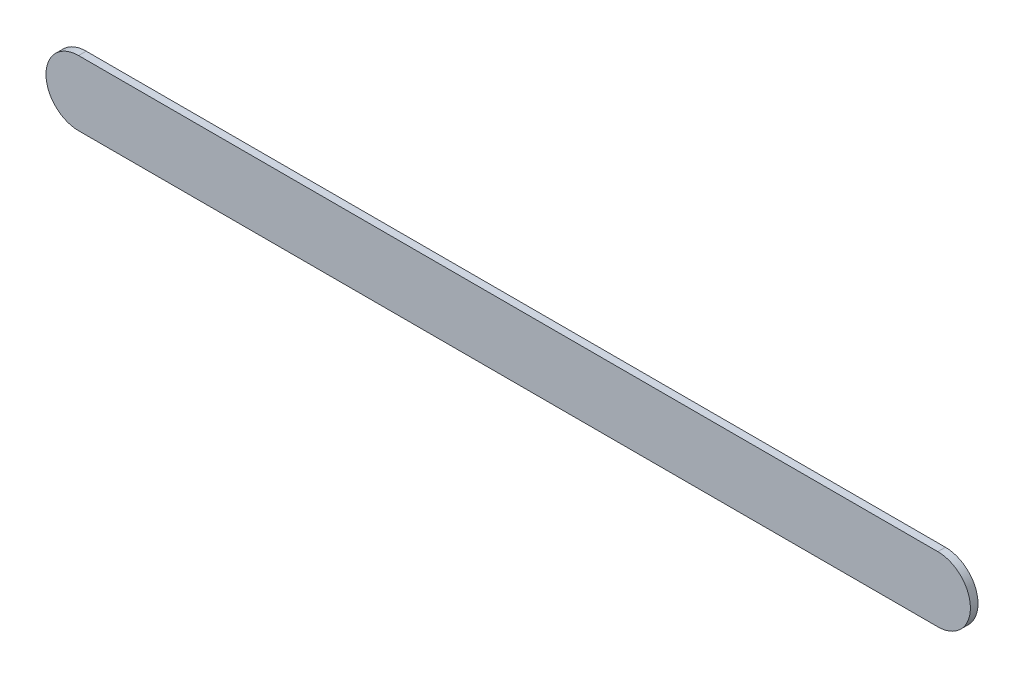
ISO-10303-21;
HEADER;
FILE_DESCRIPTION(('STEP AP214'),'2;1');
FILE_NAME('part.step','',(''),(''),'','','');
FILE_SCHEMA(('AUTOMOTIVE_DESIGN { 1 0 10303 214 1 1 1 1 }'));
ENDSEC;
DATA;
#1=APPLICATION_CONTEXT('core data for automotive mechanical design processes');
#2=APPLICATION_PROTOCOL_DEFINITION('international standard','automotive_design',2000,#1);
#3=PRODUCT_CONTEXT('',#1,'mechanical');
#4=PRODUCT('Part','Part','',(#3));
#5=PRODUCT_RELATED_PRODUCT_CATEGORY('part','',(#4));
#6=PRODUCT_DEFINITION_FORMATION('','',#4);
#7=PRODUCT_DEFINITION_CONTEXT('part definition',#1,'design');
#8=PRODUCT_DEFINITION('design','',#6,#7);
#9=PRODUCT_DEFINITION_SHAPE('','',#8);
#10=(LENGTH_UNIT() NAMED_UNIT(*) SI_UNIT(.MILLI.,.METRE.));
#11=(NAMED_UNIT(*) PLANE_ANGLE_UNIT() SI_UNIT($,.RADIAN.));
#12=(NAMED_UNIT(*) SI_UNIT($,.STERADIAN.) SOLID_ANGLE_UNIT());
#13=UNCERTAINTY_MEASURE_WITH_UNIT(LENGTH_MEASURE(1.E-05),#10,'distance_accuracy_value','');
#14=(GEOMETRIC_REPRESENTATION_CONTEXT(3) GLOBAL_UNCERTAINTY_ASSIGNED_CONTEXT((#13)) GLOBAL_UNIT_ASSIGNED_CONTEXT((#10,
#11,#12)) REPRESENTATION_CONTEXT('',''));
#15=CARTESIAN_POINT('',(0.,0.,0.));
#16=DIRECTION('',(0.,0.,1.));
#17=DIRECTION('',(1.,0.,0.));
#18=AXIS2_PLACEMENT_3D('',#15,#16,#17);
#19=CARTESIAN_POINT('',(131.4125,-67.149999,1.635));
#20=DIRECTION('',(0.,0.,1.));
#21=DIRECTION('',(1.,0.,0.));
#22=AXIS2_PLACEMENT_3D('',#19,#20,#21);
#23=PLANE('',#22);
#24=DIRECTION('',(1.,0.,0.));
#25=VECTOR('',#24,1.);
#26=CARTESIAN_POINT('',(131.4125,-67.149999,1.635));
#27=LINE('',#26,#25);
#28=CARTESIAN_POINT('',(131.4125,-67.149999,1.635));
#29=VERTEX_POINT('',#28);
#30=CARTESIAN_POINT('',(135.370001,-67.149999,1.635));
#31=VERTEX_POINT('',#30);
#32=EDGE_CURVE('E92',#29,#31,#27,.T.);
#33=ORIENTED_EDGE('',*,*,#32,.T.);
#34=CARTESIAN_POINT('',(135.370001,-66.999999,1.635));
#35=DIRECTION('',(0.,0.,1.));
#36=DIRECTION('',(0.,-1.,0.));
#37=AXIS2_PLACEMENT_3D('',#34,#35,#36);
#38=CIRCLE('',#37,0.15);
#39=CARTESIAN_POINT('',(135.370001,-66.849999,1.635));
#40=VERTEX_POINT('',#39);
#41=EDGE_CURVE('E87',#31,#40,#38,.T.);
#42=ORIENTED_EDGE('',*,*,#41,.T.);
#43=DIRECTION('',(-1.,0.,0.));
#44=VECTOR('',#43,1.);
#45=CARTESIAN_POINT('',(135.370001,-66.849999,1.635));
#46=LINE('',#45,#44);
#47=CARTESIAN_POINT('',(131.4125,-66.849999,1.635));
#48=VERTEX_POINT('',#47);
#49=EDGE_CURVE('E102',#40,#48,#46,.T.);
#50=ORIENTED_EDGE('',*,*,#49,.T.);
#51=CARTESIAN_POINT('',(131.4125,-66.999999,1.635));
#52=DIRECTION('',(0.,0.,1.));
#53=DIRECTION('',(1.894780628694E-13,1.,0.));
#54=AXIS2_PLACEMENT_3D('',#51,#52,#53);
#55=CIRCLE('',#54,0.15);
#56=EDGE_CURVE('E11',#48,#29,#55,.T.);
#57=ORIENTED_EDGE('',*,*,#56,.T.);
#58=EDGE_LOOP('',(#33,#42,#50,#57));
#59=FACE_BOUND('',#58,.T.);
#60=ADVANCED_FACE('F17',(#59),#23,.T.);
#61=CARTESIAN_POINT('',(131.4125,-67.149999,1.6));
#62=DIRECTION('',(0.,0.,1.));
#63=DIRECTION('',(1.,0.,0.));
#64=AXIS2_PLACEMENT_3D('',#61,#62,#63);
#65=PLANE('',#64);
#66=CARTESIAN_POINT('',(131.4125,-66.999999,1.6));
#67=DIRECTION('',(0.,0.,1.));
#68=DIRECTION('',(1.894780628694E-13,1.,0.));
#69=AXIS2_PLACEMENT_3D('',#66,#67,#68);
#70=CIRCLE('',#69,0.15);
#71=CARTESIAN_POINT('',(131.4125,-66.849999,1.6));
#72=VERTEX_POINT('',#71);
#73=CARTESIAN_POINT('',(131.4125,-67.149999,1.6));
#74=VERTEX_POINT('',#73);
#75=EDGE_CURVE('E26',#72,#74,#70,.T.);
#76=ORIENTED_EDGE('',*,*,#75,.F.);
#77=DIRECTION('',(-1.,0.,0.));
#78=VECTOR('',#77,1.);
#79=CARTESIAN_POINT('',(135.370001,-66.849999,1.6));
#80=LINE('',#79,#78);
#81=CARTESIAN_POINT('',(135.370001,-66.849999,1.6));
#82=VERTEX_POINT('',#81);
#83=EDGE_CURVE('E75',#82,#72,#80,.T.);
#84=ORIENTED_EDGE('',*,*,#83,.F.);
#85=CARTESIAN_POINT('',(135.370001,-66.999999,1.6));
#86=DIRECTION('',(0.,0.,1.));
#87=DIRECTION('',(0.,-1.,0.));
#88=AXIS2_PLACEMENT_3D('',#85,#86,#87);
#89=CIRCLE('',#88,0.15);
#90=CARTESIAN_POINT('',(135.370001,-67.149999,1.6));
#91=VERTEX_POINT('',#90);
#92=EDGE_CURVE('E69',#91,#82,#89,.T.);
#93=ORIENTED_EDGE('',*,*,#92,.F.);
#94=DIRECTION('',(1.,0.,0.));
#95=VECTOR('',#94,1.);
#96=CARTESIAN_POINT('',(131.4125,-67.149999,1.6));
#97=LINE('',#96,#95);
#98=EDGE_CURVE('E73',#74,#91,#97,.T.);
#99=ORIENTED_EDGE('',*,*,#98,.F.);
#100=EDGE_LOOP('',(#76,#84,#93,#99));
#101=FACE_BOUND('',#100,.T.);
#102=ADVANCED_FACE('F71',(#101),#65,.F.);
#103=CARTESIAN_POINT('',(131.4125,-66.999999,1.6));
#104=DIRECTION('',(0.,0.,-1.));
#105=DIRECTION('',(1.894780628694E-13,1.,0.));
#106=AXIS2_PLACEMENT_3D('',#103,#104,#105);
#107=CYLINDRICAL_SURFACE('',#106,0.15);
#108=ORIENTED_EDGE('',*,*,#75,.T.);
#109=DIRECTION('',(0.,0.,1.));
#110=VECTOR('',#109,1.);
#111=CARTESIAN_POINT('',(131.4125,-67.149999,1.6));
#112=LINE('',#111,#110);
#113=EDGE_CURVE('E81',#74,#29,#112,.T.);
#114=ORIENTED_EDGE('',*,*,#113,.T.);
#115=ORIENTED_EDGE('',*,*,#56,.F.);
#116=DIRECTION('',(0.,0.,1.));
#117=VECTOR('',#116,1.);
#118=CARTESIAN_POINT('',(131.4125,-66.849999,1.6));
#119=LINE('',#118,#117);
#120=EDGE_CURVE('E20',#72,#48,#119,.T.);
#121=ORIENTED_EDGE('',*,*,#120,.F.);
#122=EDGE_LOOP('',(#108,#114,#115,#121));
#123=FACE_BOUND('',#122,.T.);
#124=ADVANCED_FACE('F123',(#123),#107,.T.);
#125=CARTESIAN_POINT('',(135.370001,-66.849999,1.6));
#126=DIRECTION('',(0.,-1.,0.));
#127=DIRECTION('',(0.,0.,-1.));
#128=AXIS2_PLACEMENT_3D('',#125,#126,#127);
#129=PLANE('',#128);
#130=ORIENTED_EDGE('',*,*,#83,.T.);
#131=ORIENTED_EDGE('',*,*,#120,.T.);
#132=ORIENTED_EDGE('',*,*,#49,.F.);
#133=DIRECTION('',(0.,0.,1.));
#134=VECTOR('',#133,1.);
#135=CARTESIAN_POINT('',(135.370001,-66.849999,1.6));
#136=LINE('',#135,#134);
#137=EDGE_CURVE('E80',#82,#40,#136,.T.);
#138=ORIENTED_EDGE('',*,*,#137,.F.);
#139=EDGE_LOOP('',(#130,#131,#132,#138));
#140=FACE_BOUND('',#139,.T.);
#141=ADVANCED_FACE('F122',(#140),#129,.F.);
#142=CARTESIAN_POINT('',(135.370001,-66.999999,1.6));
#143=DIRECTION('',(0.,0.,-1.));
#144=DIRECTION('',(0.,-1.,0.));
#145=AXIS2_PLACEMENT_3D('',#142,#143,#144);
#146=CYLINDRICAL_SURFACE('',#145,0.15);
#147=ORIENTED_EDGE('',*,*,#92,.T.);
#148=ORIENTED_EDGE('',*,*,#137,.T.);
#149=ORIENTED_EDGE('',*,*,#41,.F.);
#150=DIRECTION('',(0.,0.,1.));
#151=VECTOR('',#150,1.);
#152=CARTESIAN_POINT('',(135.370001,-67.149999,1.6));
#153=LINE('',#152,#151);
#154=EDGE_CURVE('E84',#91,#31,#153,.T.);
#155=ORIENTED_EDGE('',*,*,#154,.F.);
#156=EDGE_LOOP('',(#147,#148,#149,#155));
#157=FACE_BOUND('',#156,.T.);
#158=ADVANCED_FACE('F85',(#157),#146,.T.);
#159=CARTESIAN_POINT('',(131.4125,-67.149999,1.6));
#160=DIRECTION('',(0.,1.,0.));
#161=DIRECTION('',(1.,0.,0.));
#162=AXIS2_PLACEMENT_3D('',#159,#160,#161);
#163=PLANE('',#162);
#164=ORIENTED_EDGE('',*,*,#98,.T.);
#165=ORIENTED_EDGE('',*,*,#154,.T.);
#166=ORIENTED_EDGE('',*,*,#32,.F.);
#167=ORIENTED_EDGE('',*,*,#113,.F.);
#168=EDGE_LOOP('',(#164,#165,#166,#167));
#169=FACE_BOUND('',#168,.T.);
#170=ADVANCED_FACE('F95',(#169),#163,.F.);
#171=CLOSED_SHELL('',(#60,#102,#124,#141,#158,#170));
#172=MANIFOLD_SOLID_BREP('B1',#171);
#173=ADVANCED_BREP_SHAPE_REPRESENTATION('',(#18,#172),#14);
#174=SHAPE_DEFINITION_REPRESENTATION(#9,#173);
ENDSEC;
END-ISO-10303-21;
